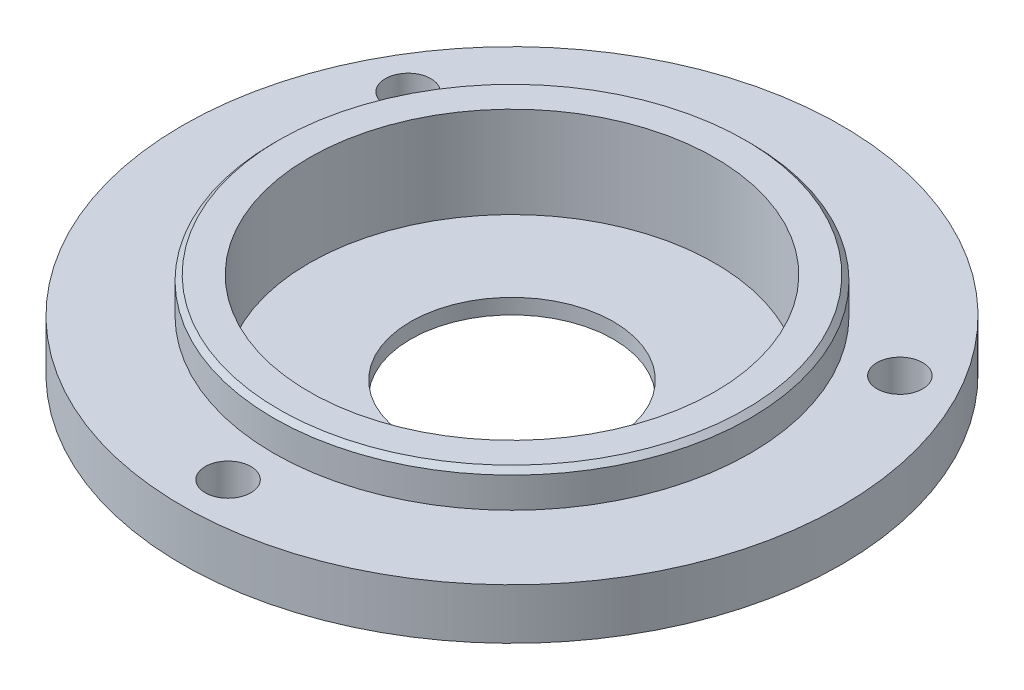
ISO-10303-21;
HEADER;
FILE_DESCRIPTION(('STEP AP214'),'2;1');
FILE_NAME('part.step','',(''),(''),'','','');
FILE_SCHEMA(('AUTOMOTIVE_DESIGN { 1 0 10303 214 1 1 1 1 }'));
ENDSEC;
DATA;
#1=APPLICATION_CONTEXT('core data for automotive mechanical design processes');
#2=APPLICATION_PROTOCOL_DEFINITION('international standard','automotive_design',2000,#1);
#3=PRODUCT_CONTEXT('',#1,'mechanical');
#4=PRODUCT('Part','Part','',(#3));
#5=PRODUCT_RELATED_PRODUCT_CATEGORY('part','',(#4));
#6=PRODUCT_DEFINITION_FORMATION('','',#4);
#7=PRODUCT_DEFINITION_CONTEXT('part definition',#1,'design');
#8=PRODUCT_DEFINITION('design','',#6,#7);
#9=PRODUCT_DEFINITION_SHAPE('','',#8);
#10=(LENGTH_UNIT() NAMED_UNIT(*) SI_UNIT(.MILLI.,.METRE.));
#11=(NAMED_UNIT(*) PLANE_ANGLE_UNIT() SI_UNIT($,.RADIAN.));
#12=(NAMED_UNIT(*) SI_UNIT($,.STERADIAN.) SOLID_ANGLE_UNIT());
#13=UNCERTAINTY_MEASURE_WITH_UNIT(LENGTH_MEASURE(1.E-05),#10,'distance_accuracy_value','');
#14=(GEOMETRIC_REPRESENTATION_CONTEXT(3) GLOBAL_UNCERTAINTY_ASSIGNED_CONTEXT((#13)) GLOBAL_UNIT_ASSIGNED_CONTEXT((#10,
#11,#12)) REPRESENTATION_CONTEXT('',''));
#15=CARTESIAN_POINT('',(0.,0.,0.));
#16=DIRECTION('',(0.,0.,1.));
#17=DIRECTION('',(1.,0.,0.));
#18=AXIS2_PLACEMENT_3D('',#15,#16,#17);
#19=CARTESIAN_POINT('',(-22.,-7.00000000000001,0.));
#20=DIRECTION('',(0.,-1.,0.));
#21=DIRECTION('',(1.,0.,0.));
#22=AXIS2_PLACEMENT_3D('',#19,#20,#21);
#23=PLANE('',#22);
#24=CARTESIAN_POINT('',(0.,-7.00000000000001,0.));
#25=DIRECTION('',(0.,1.,0.));
#26=DIRECTION('',(-1.,0.,0.));
#27=AXIS2_PLACEMENT_3D('',#24,#25,#26);
#28=CIRCLE('',#27,10.);
#29=CARTESIAN_POINT('',(-10.,-7.00000000000001,0.));
#30=VERTEX_POINT('',#29);
#31=EDGE_CURVE('E10',#30,#30,#28,.T.);
#32=ORIENTED_EDGE('',*,*,#31,.T.);
#33=EDGE_LOOP('',(#32));
#34=FACE_BOUND('',#33,.T.);
#35=CARTESIAN_POINT('',(0.,-7.00000000000001,0.));
#36=DIRECTION('',(0.,1.,0.));
#37=DIRECTION('',(-1.,0.,0.));
#38=AXIS2_PLACEMENT_3D('',#35,#36,#37);
#39=CIRCLE('',#38,22.);
#40=CARTESIAN_POINT('',(-22.,-7.00000000000001,0.));
#41=VERTEX_POINT('',#40);
#42=EDGE_CURVE('E50',#41,#41,#39,.T.);
#43=ORIENTED_EDGE('',*,*,#42,.F.);
#44=EDGE_LOOP('',(#43));
#45=FACE_BOUND('',#44,.T.);
#46=ADVANCED_FACE('F32',(#34,#45),#23,.T.);
#47=CARTESIAN_POINT('',(0.,39.1070951585977,0.));
#48=DIRECTION('',(0.,1.,0.));
#49=DIRECTION('',(-1.,0.,0.));
#50=AXIS2_PLACEMENT_3D('',#47,#48,#49);
#51=CYLINDRICAL_SURFACE('',#50,10.);
#52=CARTESIAN_POINT('',(0.,-5.50000000000001,0.));
#53=DIRECTION('',(0.,1.,0.));
#54=DIRECTION('',(-1.,0.,0.));
#55=AXIS2_PLACEMENT_3D('',#52,#53,#54);
#56=CIRCLE('',#55,10.);
#57=CARTESIAN_POINT('',(-10.,-5.50000000000001,0.));
#58=VERTEX_POINT('',#57);
#59=EDGE_CURVE('E39',#58,#58,#56,.T.);
#60=ORIENTED_EDGE('',*,*,#59,.T.);
#61=EDGE_LOOP('',(#60));
#62=FACE_BOUND('',#61,.T.);
#63=ORIENTED_EDGE('',*,*,#31,.F.);
#64=EDGE_LOOP('',(#63));
#65=FACE_BOUND('',#64,.T.);
#66=ADVANCED_FACE('F107',(#62,#65),#51,.F.);
#67=CARTESIAN_POINT('',(-9.99999999999999,-5.50000000000001,0.));
#68=DIRECTION('',(0.,1.,0.));
#69=DIRECTION('',(-1.,0.,0.));
#70=AXIS2_PLACEMENT_3D('',#67,#68,#69);
#71=PLANE('',#70);
#72=CARTESIAN_POINT('',(0.,-5.50000000000001,0.));
#73=DIRECTION('',(0.,1.,0.));
#74=DIRECTION('',(-1.,0.,0.));
#75=AXIS2_PLACEMENT_3D('',#72,#73,#74);
#76=CIRCLE('',#75,20.);
#77=CARTESIAN_POINT('',(-20.,-5.50000000000001,0.));
#78=VERTEX_POINT('',#77);
#79=EDGE_CURVE('E44',#78,#78,#76,.T.);
#80=ORIENTED_EDGE('',*,*,#79,.T.);
#81=EDGE_LOOP('',(#80));
#82=FACE_BOUND('',#81,.T.);
#83=ORIENTED_EDGE('',*,*,#59,.F.);
#84=EDGE_LOOP('',(#83));
#85=FACE_BOUND('',#84,.T.);
#86=ADVANCED_FACE('F92',(#82,#85),#71,.T.);
#87=CARTESIAN_POINT('',(0.,39.1070951585977,0.));
#88=DIRECTION('',(0.,1.,0.));
#89=DIRECTION('',(-1.,0.,0.));
#90=AXIS2_PLACEMENT_3D('',#87,#88,#89);
#91=CYLINDRICAL_SURFACE('',#90,20.);
#92=CARTESIAN_POINT('',(0.,3.5,0.));
#93=DIRECTION('',(0.,1.,0.));
#94=DIRECTION('',(-1.,0.,0.));
#95=AXIS2_PLACEMENT_3D('',#92,#93,#94);
#96=CIRCLE('',#95,20.);
#97=CARTESIAN_POINT('',(-20.,3.5,0.));
#98=VERTEX_POINT('',#97);
#99=EDGE_CURVE('E87',#98,#98,#96,.T.);
#100=ORIENTED_EDGE('',*,*,#99,.T.);
#101=EDGE_LOOP('',(#100));
#102=FACE_BOUND('',#101,.T.);
#103=ORIENTED_EDGE('',*,*,#79,.F.);
#104=EDGE_LOOP('',(#103));
#105=FACE_BOUND('',#104,.T.);
#106=ADVANCED_FACE('F95',(#102,#105),#91,.F.);
#107=CARTESIAN_POINT('',(-20.,3.5,0.));
#108=DIRECTION('',(0.,1.,0.));
#109=DIRECTION('',(-1.,0.,0.));
#110=AXIS2_PLACEMENT_3D('',#107,#108,#109);
#111=PLANE('',#110);
#112=CARTESIAN_POINT('',(0.,3.5,0.));
#113=DIRECTION('',(0.,1.,0.));
#114=DIRECTION('',(-1.,0.,0.));
#115=AXIS2_PLACEMENT_3D('',#112,#113,#114);
#116=CIRCLE('',#115,23.);
#117=CARTESIAN_POINT('',(-23.,3.5,0.));
#118=VERTEX_POINT('',#117);
#119=EDGE_CURVE('E84',#118,#118,#116,.T.);
#120=ORIENTED_EDGE('',*,*,#119,.T.);
#121=EDGE_LOOP('',(#120));
#122=FACE_BOUND('',#121,.T.);
#123=ORIENTED_EDGE('',*,*,#99,.F.);
#124=EDGE_LOOP('',(#123));
#125=FACE_BOUND('',#124,.T.);
#126=ADVANCED_FACE('F97',(#122,#125),#111,.T.);
#127=CARTESIAN_POINT('',(0.,3.5,0.));
#128=DIRECTION('',(0.,-1.,0.));
#129=DIRECTION('',(1.,0.,0.));
#130=AXIS2_PLACEMENT_3D('',#127,#128,#129);
#131=CONICAL_SURFACE('',#130,23.,0.785398163397448);
#132=CARTESIAN_POINT('',(0.,3.,0.));
#133=DIRECTION('',(0.,1.,0.));
#134=DIRECTION('',(-1.,0.,0.));
#135=AXIS2_PLACEMENT_3D('',#132,#133,#134);
#136=CIRCLE('',#135,23.5);
#137=CARTESIAN_POINT('',(-23.5,3.,0.));
#138=VERTEX_POINT('',#137);
#139=EDGE_CURVE('E81',#138,#138,#136,.T.);
#140=ORIENTED_EDGE('',*,*,#139,.T.);
#141=EDGE_LOOP('',(#140));
#142=FACE_BOUND('',#141,.T.);
#143=ORIENTED_EDGE('',*,*,#119,.F.);
#144=EDGE_LOOP('',(#143));
#145=FACE_BOUND('',#144,.T.);
#146=ADVANCED_FACE('F104',(#142,#145),#131,.T.);
#147=CARTESIAN_POINT('',(0.,39.1070951585977,0.));
#148=DIRECTION('',(0.,1.,0.));
#149=DIRECTION('',(-1.,0.,0.));
#150=AXIS2_PLACEMENT_3D('',#147,#148,#149);
#151=CYLINDRICAL_SURFACE('',#150,23.5);
#152=CARTESIAN_POINT('',(0.,0.,0.));
#153=DIRECTION('',(0.,1.,0.));
#154=DIRECTION('',(-1.,0.,0.));
#155=AXIS2_PLACEMENT_3D('',#152,#153,#154);
#156=CIRCLE('',#155,23.5);
#157=CARTESIAN_POINT('',(-23.5,0.,0.));
#158=VERTEX_POINT('',#157);
#159=EDGE_CURVE('E78',#158,#158,#156,.T.);
#160=ORIENTED_EDGE('',*,*,#159,.T.);
#161=EDGE_LOOP('',(#160));
#162=FACE_BOUND('',#161,.T.);
#163=ORIENTED_EDGE('',*,*,#139,.F.);
#164=EDGE_LOOP('',(#163));
#165=FACE_BOUND('',#164,.T.);
#166=ADVANCED_FACE('F140',(#162,#165),#151,.T.);
#167=CARTESIAN_POINT('',(-23.5,0.,0.));
#168=DIRECTION('',(0.,1.,0.));
#169=DIRECTION('',(-1.,0.,0.));
#170=AXIS2_PLACEMENT_3D('',#167,#168,#169);
#171=PLANE('',#170);
#172=CARTESIAN_POINT('',(24.2487113059644,0.,-13.9999999999998));
#173=DIRECTION('',(0.,1.,0.));
#174=DIRECTION('',(0.499999999999992,0.,0.866025403784443));
#175=AXIS2_PLACEMENT_3D('',#172,#173,#174);
#176=CIRCLE('',#175,2.25);
#177=CARTESIAN_POINT('',(25.3737113059644,0.,-12.0514428414848));
#178=VERTEX_POINT('',#177);
#179=EDGE_CURVE('E64',#178,#178,#176,.T.);
#180=ORIENTED_EDGE('',*,*,#179,.F.);
#181=EDGE_LOOP('',(#180));
#182=FACE_BOUND('',#181,.T.);
#183=CARTESIAN_POINT('',(-24.2487113059642,0.,-14.0000000000001));
#184=DIRECTION('',(0.,1.,0.));
#185=DIRECTION('',(0.500000000000004,0.,-0.866025403784436));
#186=AXIS2_PLACEMENT_3D('',#183,#184,#185);
#187=CIRCLE('',#186,2.25);
#188=CARTESIAN_POINT('',(-23.1237113059642,0.,-15.9485571585151));
#189=VERTEX_POINT('',#188);
#190=EDGE_CURVE('E54',#189,#189,#187,.T.);
#191=ORIENTED_EDGE('',*,*,#190,.F.);
#192=EDGE_LOOP('',(#191));
#193=FACE_BOUND('',#192,.T.);
#194=CARTESIAN_POINT('',(0.,0.,28.));
#195=DIRECTION('',(0.,1.,0.));
#196=DIRECTION('',(-1.,0.,0.));
#197=AXIS2_PLACEMENT_3D('',#194,#195,#196);
#198=CIRCLE('',#197,2.25);
#199=CARTESIAN_POINT('',(-2.25,0.,28.));
#200=VERTEX_POINT('',#199);
#201=EDGE_CURVE('E51',#200,#200,#198,.T.);
#202=ORIENTED_EDGE('',*,*,#201,.F.);
#203=EDGE_LOOP('',(#202));
#204=FACE_BOUND('',#203,.T.);
#205=CARTESIAN_POINT('',(0.,0.,0.));
#206=DIRECTION('',(0.,1.,0.));
#207=DIRECTION('',(-1.,0.,0.));
#208=AXIS2_PLACEMENT_3D('',#205,#206,#207);
#209=CIRCLE('',#208,32.5);
#210=CARTESIAN_POINT('',(-32.5,0.,0.));
#211=VERTEX_POINT('',#210);
#212=EDGE_CURVE('E75',#211,#211,#209,.T.);
#213=ORIENTED_EDGE('',*,*,#212,.T.);
#214=EDGE_LOOP('',(#213));
#215=FACE_BOUND('',#214,.T.);
#216=ORIENTED_EDGE('',*,*,#159,.F.);
#217=EDGE_LOOP('',(#216));
#218=FACE_BOUND('',#217,.T.);
#219=ADVANCED_FACE('F134',(#182,#193,#204,#215,#218),#171,.T.);
#220=CARTESIAN_POINT('',(0.,39.1070951585977,0.));
#221=DIRECTION('',(0.,1.,0.));
#222=DIRECTION('',(-1.,0.,0.));
#223=AXIS2_PLACEMENT_3D('',#220,#221,#222);
#224=CYLINDRICAL_SURFACE('',#223,32.5);
#225=CARTESIAN_POINT('',(0.,-5.,0.));
#226=DIRECTION('',(0.,1.,0.));
#227=DIRECTION('',(-1.,0.,0.));
#228=AXIS2_PLACEMENT_3D('',#225,#226,#227);
#229=CIRCLE('',#228,32.5);
#230=CARTESIAN_POINT('',(-32.5,-5.00000000000001,0.));
#231=VERTEX_POINT('',#230);
#232=EDGE_CURVE('E72',#231,#231,#229,.T.);
#233=ORIENTED_EDGE('',*,*,#232,.T.);
#234=EDGE_LOOP('',(#233));
#235=FACE_BOUND('',#234,.T.);
#236=ORIENTED_EDGE('',*,*,#212,.F.);
#237=EDGE_LOOP('',(#236));
#238=FACE_BOUND('',#237,.T.);
#239=ADVANCED_FACE('F127',(#235,#238),#224,.T.);
#240=CARTESIAN_POINT('',(-32.5,-5.,0.));
#241=DIRECTION('',(0.,-1.,0.));
#242=DIRECTION('',(1.,0.,0.));
#243=AXIS2_PLACEMENT_3D('',#240,#241,#242);
#244=PLANE('',#243);
#245=CARTESIAN_POINT('',(24.2487113059644,-5.,-13.9999999999998));
#246=DIRECTION('',(0.,-1.,0.));
#247=DIRECTION('',(1.,0.,0.));
#248=AXIS2_PLACEMENT_3D('',#245,#246,#247);
#249=CIRCLE('',#248,2.25);
#250=CARTESIAN_POINT('',(26.4987113059644,-5.,-13.9999999999998));
#251=VERTEX_POINT('',#250);
#252=EDGE_CURVE('E35',#251,#251,#249,.T.);
#253=ORIENTED_EDGE('',*,*,#252,.F.);
#254=EDGE_LOOP('',(#253));
#255=FACE_BOUND('',#254,.T.);
#256=CARTESIAN_POINT('',(-24.2487113059642,-5.,-14.0000000000001));
#257=DIRECTION('',(0.,-1.,0.));
#258=DIRECTION('',(1.,0.,0.));
#259=AXIS2_PLACEMENT_3D('',#256,#257,#258);
#260=CIRCLE('',#259,2.25);
#261=CARTESIAN_POINT('',(-21.9987113059642,-5.,-14.0000000000001));
#262=VERTEX_POINT('',#261);
#263=EDGE_CURVE('E52',#262,#262,#260,.T.);
#264=ORIENTED_EDGE('',*,*,#263,.F.);
#265=EDGE_LOOP('',(#264));
#266=FACE_BOUND('',#265,.T.);
#267=CARTESIAN_POINT('',(0.,-5.,28.));
#268=DIRECTION('',(0.,-1.,0.));
#269=DIRECTION('',(1.,0.,0.));
#270=AXIS2_PLACEMENT_3D('',#267,#268,#269);
#271=CIRCLE('',#270,2.25);
#272=CARTESIAN_POINT('',(2.25,-5.,28.));
#273=VERTEX_POINT('',#272);
#274=EDGE_CURVE('E48',#273,#273,#271,.T.);
#275=ORIENTED_EDGE('',*,*,#274,.F.);
#276=EDGE_LOOP('',(#275));
#277=FACE_BOUND('',#276,.T.);
#278=CARTESIAN_POINT('',(0.,-5.,0.));
#279=DIRECTION('',(0.,1.,0.));
#280=DIRECTION('',(-1.,0.,0.));
#281=AXIS2_PLACEMENT_3D('',#278,#279,#280);
#282=CIRCLE('',#281,22.);
#283=CARTESIAN_POINT('',(-22.,-5.00000000000001,0.));
#284=VERTEX_POINT('',#283);
#285=EDGE_CURVE('E69',#284,#284,#282,.T.);
#286=ORIENTED_EDGE('',*,*,#285,.T.);
#287=EDGE_LOOP('',(#286));
#288=FACE_BOUND('',#287,.T.);
#289=ORIENTED_EDGE('',*,*,#232,.F.);
#290=EDGE_LOOP('',(#289));
#291=FACE_BOUND('',#290,.T.);
#292=ADVANCED_FACE('F121',(#255,#266,#277,#288,#291),#244,.T.);
#293=CARTESIAN_POINT('',(0.,39.1070951585977,0.));
#294=DIRECTION('',(0.,1.,0.));
#295=DIRECTION('',(-1.,0.,0.));
#296=AXIS2_PLACEMENT_3D('',#293,#294,#295);
#297=CYLINDRICAL_SURFACE('',#296,22.);
#298=ORIENTED_EDGE('',*,*,#42,.T.);
#299=EDGE_LOOP('',(#298));
#300=FACE_BOUND('',#299,.T.);
#301=ORIENTED_EDGE('',*,*,#285,.F.);
#302=EDGE_LOOP('',(#301));
#303=FACE_BOUND('',#302,.T.);
#304=ADVANCED_FACE('F117',(#300,#303),#297,.T.);
#305=CARTESIAN_POINT('',(0.,-7.00000000000001,28.));
#306=DIRECTION('',(0.,1.,0.));
#307=DIRECTION('',(-1.,0.,0.));
#308=AXIS2_PLACEMENT_3D('',#305,#306,#307);
#309=CYLINDRICAL_SURFACE('',#308,2.25);
#310=ORIENTED_EDGE('',*,*,#274,.T.);
#311=EDGE_LOOP('',(#310));
#312=FACE_BOUND('',#311,.T.);
#313=ORIENTED_EDGE('',*,*,#201,.T.);
#314=EDGE_LOOP('',(#313));
#315=FACE_BOUND('',#314,.T.);
#316=ADVANCED_FACE('F120',(#312,#315),#309,.F.);
#317=CARTESIAN_POINT('',(-24.2487113059642,-7.00000000000001,-14.0000000000001));
#318=DIRECTION('',(0.,1.,0.));
#319=DIRECTION('',(-1.,0.,0.));
#320=AXIS2_PLACEMENT_3D('',#317,#318,#319);
#321=CYLINDRICAL_SURFACE('',#320,2.25);
#322=ORIENTED_EDGE('',*,*,#263,.T.);
#323=EDGE_LOOP('',(#322));
#324=FACE_BOUND('',#323,.T.);
#325=ORIENTED_EDGE('',*,*,#190,.T.);
#326=EDGE_LOOP('',(#325));
#327=FACE_BOUND('',#326,.T.);
#328=ADVANCED_FACE('F161',(#324,#327),#321,.F.);
#329=CARTESIAN_POINT('',(24.2487113059644,-7.00000000000001,-13.9999999999998));
#330=DIRECTION('',(0.,1.,0.));
#331=DIRECTION('',(-1.,0.,0.));
#332=AXIS2_PLACEMENT_3D('',#329,#330,#331);
#333=CYLINDRICAL_SURFACE('',#332,2.25);
#334=ORIENTED_EDGE('',*,*,#252,.T.);
#335=EDGE_LOOP('',(#334));
#336=FACE_BOUND('',#335,.T.);
#337=ORIENTED_EDGE('',*,*,#179,.T.);
#338=EDGE_LOOP('',(#337));
#339=FACE_BOUND('',#338,.T.);
#340=ADVANCED_FACE('F165',(#336,#339),#333,.F.);
#341=CLOSED_SHELL('',(#46,#66,#86,#106,#126,#146,#166,#219,#239,#292,#304,#316,#328,#340));
#342=MANIFOLD_SOLID_BREP('B2',#341);
#343=ADVANCED_BREP_SHAPE_REPRESENTATION('',(#18,#342),#14);
#344=SHAPE_DEFINITION_REPRESENTATION(#9,#343);
ENDSEC;
END-ISO-10303-21;
